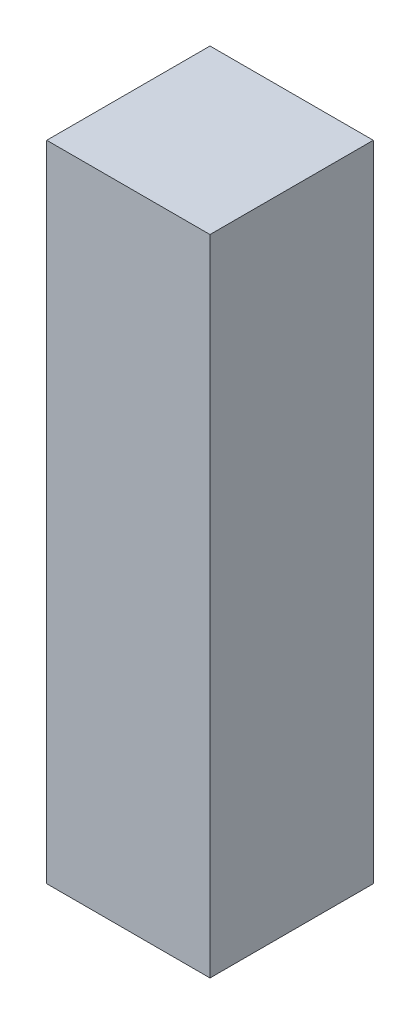
ISO-10303-21;
HEADER;
FILE_DESCRIPTION(('STEP AP214'),'2;1');
FILE_NAME('part.step','',(''),(''),'','','');
FILE_SCHEMA(('AUTOMOTIVE_DESIGN { 1 0 10303 214 1 1 1 1 }'));
ENDSEC;
DATA;
#1=APPLICATION_CONTEXT('core data for automotive mechanical design processes');
#2=APPLICATION_PROTOCOL_DEFINITION('international standard','automotive_design',2000,#1);
#3=PRODUCT_CONTEXT('',#1,'mechanical');
#4=PRODUCT('Part','Part','',(#3));
#5=PRODUCT_RELATED_PRODUCT_CATEGORY('part','',(#4));
#6=PRODUCT_DEFINITION_FORMATION('','',#4);
#7=PRODUCT_DEFINITION_CONTEXT('part definition',#1,'design');
#8=PRODUCT_DEFINITION('design','',#6,#7);
#9=PRODUCT_DEFINITION_SHAPE('','',#8);
#10=(LENGTH_UNIT() NAMED_UNIT(*) SI_UNIT(.MILLI.,.METRE.));
#11=(NAMED_UNIT(*) PLANE_ANGLE_UNIT() SI_UNIT($,.RADIAN.));
#12=(NAMED_UNIT(*) SI_UNIT($,.STERADIAN.) SOLID_ANGLE_UNIT());
#13=UNCERTAINTY_MEASURE_WITH_UNIT(LENGTH_MEASURE(1.E-05),#10,'distance_accuracy_value','');
#14=(GEOMETRIC_REPRESENTATION_CONTEXT(3) GLOBAL_UNCERTAINTY_ASSIGNED_CONTEXT((#13)) GLOBAL_UNIT_ASSIGNED_CONTEXT((#10,
#11,#12)) REPRESENTATION_CONTEXT('',''));
#15=CARTESIAN_POINT('',(0.,0.,0.));
#16=DIRECTION('',(0.,0.,1.));
#17=DIRECTION('',(1.,0.,0.));
#18=AXIS2_PLACEMENT_3D('',#15,#16,#17);
#19=CARTESIAN_POINT('',(8000.,63100.,7476.53402136892));
#20=DIRECTION('',(-1.,0.,0.));
#21=DIRECTION('',(0.,0.,1.));
#22=AXIS2_PLACEMENT_3D('',#19,#20,#21);
#23=PLANE('',#22);
#24=DIRECTION('',(0.,0.,-1.));
#25=VECTOR('',#24,1.);
#26=CARTESIAN_POINT('',(8000.,0.,7476.53402136892));
#27=LINE('',#26,#25);
#28=CARTESIAN_POINT('',(8000.,0.,7476.53402136892));
#29=VERTEX_POINT('',#28);
#30=CARTESIAN_POINT('',(8000.,0.,-8523.46597863108));
#31=VERTEX_POINT('',#30);
#32=EDGE_CURVE('E107',#29,#31,#27,.T.);
#33=ORIENTED_EDGE('',*,*,#32,.T.);
#34=DIRECTION('',(0.,-1.,0.));
#35=VECTOR('',#34,1.);
#36=CARTESIAN_POINT('',(8000.,63100.,-8523.46597863108));
#37=LINE('',#36,#35);
#38=CARTESIAN_POINT('',(8000.,63100.,-8523.46597863108));
#39=VERTEX_POINT('',#38);
#40=EDGE_CURVE('E11',#39,#31,#37,.T.);
#41=ORIENTED_EDGE('',*,*,#40,.F.);
#42=DIRECTION('',(0.,0.,-1.));
#43=VECTOR('',#42,1.);
#44=CARTESIAN_POINT('',(8000.,63100.,7476.53402136892));
#45=LINE('',#44,#43);
#46=CARTESIAN_POINT('',(8000.,63100.,7476.53402136892));
#47=VERTEX_POINT('',#46);
#48=EDGE_CURVE('E91',#47,#39,#45,.T.);
#49=ORIENTED_EDGE('',*,*,#48,.F.);
#50=DIRECTION('',(0.,-1.,0.));
#51=VECTOR('',#50,1.);
#52=CARTESIAN_POINT('',(8000.,63100.,7476.53402136892));
#53=LINE('',#52,#51);
#54=EDGE_CURVE('E103',#47,#29,#53,.T.);
#55=ORIENTED_EDGE('',*,*,#54,.T.);
#56=EDGE_LOOP('',(#33,#41,#49,#55));
#57=FACE_BOUND('',#56,.T.);
#58=ADVANCED_FACE('F39',(#57),#23,.F.);
#59=CARTESIAN_POINT('',(-8000.,63100.,-8523.46597863108));
#60=DIRECTION('',(0.,0.,1.));
#61=DIRECTION('',(1.,0.,0.));
#62=AXIS2_PLACEMENT_3D('',#59,#60,#61);
#63=PLANE('',#62);
#64=DIRECTION('',(-1.,0.,0.));
#65=VECTOR('',#64,1.);
#66=CARTESIAN_POINT('',(-8000.,0.,-8523.46597863108));
#67=LINE('',#66,#65);
#68=CARTESIAN_POINT('',(-8000.,0.,-8523.46597863108));
#69=VERTEX_POINT('',#68);
#70=EDGE_CURVE('E96',#31,#69,#67,.T.);
#71=ORIENTED_EDGE('',*,*,#70,.T.);
#72=DIRECTION('',(0.,-1.,0.));
#73=VECTOR('',#72,1.);
#74=CARTESIAN_POINT('',(-8000.,63100.,-8523.46597863108));
#75=LINE('',#74,#73);
#76=CARTESIAN_POINT('',(-8000.,63100.,-8523.46597863108));
#77=VERTEX_POINT('',#76);
#78=EDGE_CURVE('E48',#77,#69,#75,.T.);
#79=ORIENTED_EDGE('',*,*,#78,.F.);
#80=DIRECTION('',(-1.,0.,0.));
#81=VECTOR('',#80,1.);
#82=CARTESIAN_POINT('',(-8000.,63100.,-8523.46597863108));
#83=LINE('',#82,#81);
#84=EDGE_CURVE('E86',#39,#77,#83,.T.);
#85=ORIENTED_EDGE('',*,*,#84,.F.);
#86=ORIENTED_EDGE('',*,*,#40,.T.);
#87=EDGE_LOOP('',(#71,#79,#85,#86));
#88=FACE_BOUND('',#87,.T.);
#89=ADVANCED_FACE('F95',(#88),#63,.F.);
#90=CARTESIAN_POINT('',(-8000.,63100.,7476.53402136892));
#91=DIRECTION('',(1.,0.,0.));
#92=DIRECTION('',(0.,0.,-1.));
#93=AXIS2_PLACEMENT_3D('',#90,#91,#92);
#94=PLANE('',#93);
#95=DIRECTION('',(0.,0.,1.));
#96=VECTOR('',#95,1.);
#97=CARTESIAN_POINT('',(-8000.,0.,7476.53402136892));
#98=LINE('',#97,#96);
#99=CARTESIAN_POINT('',(-8000.,0.,7476.53402136892));
#100=VERTEX_POINT('',#99);
#101=EDGE_CURVE('E73',#69,#100,#98,.T.);
#102=ORIENTED_EDGE('',*,*,#101,.T.);
#103=DIRECTION('',(0.,-1.,0.));
#104=VECTOR('',#103,1.);
#105=CARTESIAN_POINT('',(-8000.,63100.,7476.53402136892));
#106=LINE('',#105,#104);
#107=CARTESIAN_POINT('',(-8000.,63100.,7476.53402136892));
#108=VERTEX_POINT('',#107);
#109=EDGE_CURVE('E98',#108,#100,#106,.T.);
#110=ORIENTED_EDGE('',*,*,#109,.F.);
#111=DIRECTION('',(0.,0.,1.));
#112=VECTOR('',#111,1.);
#113=CARTESIAN_POINT('',(-8000.,63100.,7476.53402136892));
#114=LINE('',#113,#112);
#115=EDGE_CURVE('E89',#77,#108,#114,.T.);
#116=ORIENTED_EDGE('',*,*,#115,.F.);
#117=ORIENTED_EDGE('',*,*,#78,.T.);
#118=EDGE_LOOP('',(#102,#110,#116,#117));
#119=FACE_BOUND('',#118,.T.);
#120=ADVANCED_FACE('F99',(#119),#94,.F.);
#121=CARTESIAN_POINT('',(-8000.,63100.,7476.53402136892));
#122=DIRECTION('',(0.,0.,-1.));
#123=DIRECTION('',(-1.,0.,0.));
#124=AXIS2_PLACEMENT_3D('',#121,#122,#123);
#125=PLANE('',#124);
#126=DIRECTION('',(1.,0.,0.));
#127=VECTOR('',#126,1.);
#128=CARTESIAN_POINT('',(-8000.,0.,7476.53402136892));
#129=LINE('',#128,#127);
#130=EDGE_CURVE('E79',#100,#29,#129,.T.);
#131=ORIENTED_EDGE('',*,*,#130,.T.);
#132=ORIENTED_EDGE('',*,*,#54,.F.);
#133=DIRECTION('',(1.,0.,0.));
#134=VECTOR('',#133,1.);
#135=CARTESIAN_POINT('',(-8000.,63100.,7476.53402136892));
#136=LINE('',#135,#134);
#137=EDGE_CURVE('E56',#108,#47,#136,.T.);
#138=ORIENTED_EDGE('',*,*,#137,.F.);
#139=ORIENTED_EDGE('',*,*,#109,.T.);
#140=EDGE_LOOP('',(#131,#132,#138,#139));
#141=FACE_BOUND('',#140,.T.);
#142=ADVANCED_FACE('F120',(#141),#125,.F.);
#143=CARTESIAN_POINT('',(0.,63100.,0.));
#144=DIRECTION('',(0.,-1.,0.));
#145=DIRECTION('',(0.,0.,-1.));
#146=AXIS2_PLACEMENT_3D('',#143,#144,#145);
#147=PLANE('',#146);
#148=ORIENTED_EDGE('',*,*,#48,.T.);
#149=ORIENTED_EDGE('',*,*,#84,.T.);
#150=ORIENTED_EDGE('',*,*,#115,.T.);
#151=ORIENTED_EDGE('',*,*,#137,.T.);
#152=EDGE_LOOP('',(#148,#149,#150,#151));
#153=FACE_BOUND('',#152,.T.);
#154=ADVANCED_FACE('F87',(#153),#147,.F.);
#155=CARTESIAN_POINT('',(0.,0.,0.));
#156=DIRECTION('',(0.,-1.,0.));
#157=DIRECTION('',(0.,0.,-1.));
#158=AXIS2_PLACEMENT_3D('',#155,#156,#157);
#159=PLANE('',#158);
#160=ORIENTED_EDGE('',*,*,#32,.F.);
#161=ORIENTED_EDGE('',*,*,#130,.F.);
#162=ORIENTED_EDGE('',*,*,#101,.F.);
#163=ORIENTED_EDGE('',*,*,#70,.F.);
#164=EDGE_LOOP('',(#160,#161,#162,#163));
#165=FACE_BOUND('',#164,.T.);
#166=ADVANCED_FACE('F123',(#165),#159,.T.);
#167=CLOSED_SHELL('',(#58,#89,#120,#142,#154,#166));
#168=MANIFOLD_SOLID_BREP('B2',#167);
#169=ADVANCED_BREP_SHAPE_REPRESENTATION('',(#18,#168),#14);
#170=SHAPE_DEFINITION_REPRESENTATION(#9,#169);
ENDSEC;
END-ISO-10303-21;
